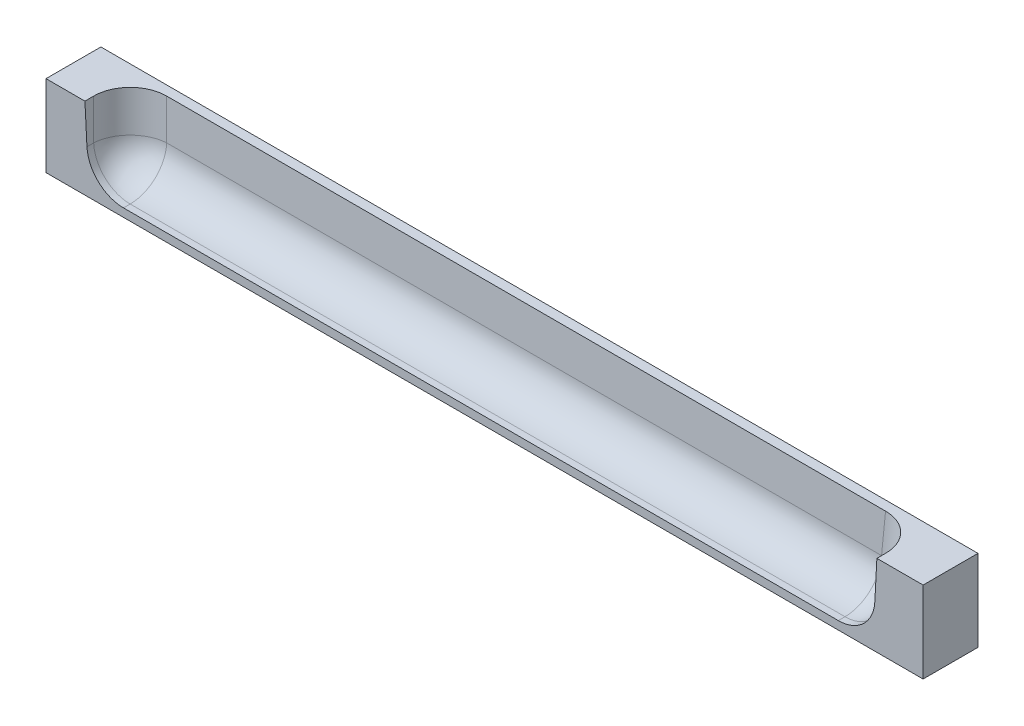
ISO-10303-21;
HEADER;
FILE_DESCRIPTION(('STEP AP214'),'2;1');
FILE_NAME('part.step','',(''),(''),'','','');
FILE_SCHEMA(('AUTOMOTIVE_DESIGN { 1 0 10303 214 1 1 1 1 }'));
ENDSEC;
DATA;
#1=APPLICATION_CONTEXT('core data for automotive mechanical design processes');
#2=APPLICATION_PROTOCOL_DEFINITION('international standard','automotive_design',2000,#1);
#3=PRODUCT_CONTEXT('',#1,'mechanical');
#4=PRODUCT('Part','Part','',(#3));
#5=PRODUCT_RELATED_PRODUCT_CATEGORY('part','',(#4));
#6=PRODUCT_DEFINITION_FORMATION('','',#4);
#7=PRODUCT_DEFINITION_CONTEXT('part definition',#1,'design');
#8=PRODUCT_DEFINITION('design','',#6,#7);
#9=PRODUCT_DEFINITION_SHAPE('','',#8);
#10=(LENGTH_UNIT() NAMED_UNIT(*) SI_UNIT(.MILLI.,.METRE.));
#11=(NAMED_UNIT(*) PLANE_ANGLE_UNIT() SI_UNIT($,.RADIAN.));
#12=(NAMED_UNIT(*) SI_UNIT($,.STERADIAN.) SOLID_ANGLE_UNIT());
#13=UNCERTAINTY_MEASURE_WITH_UNIT(LENGTH_MEASURE(1.E-05),#10,'distance_accuracy_value','');
#14=(GEOMETRIC_REPRESENTATION_CONTEXT(3) GLOBAL_UNCERTAINTY_ASSIGNED_CONTEXT((#13)) GLOBAL_UNIT_ASSIGNED_CONTEXT((#10,
#11,#12)) REPRESENTATION_CONTEXT('',''));
#15=CARTESIAN_POINT('',(0.,0.,0.));
#16=DIRECTION('',(0.,0.,1.));
#17=DIRECTION('',(1.,0.,0.));
#18=AXIS2_PLACEMENT_3D('',#15,#16,#17);
#19=CARTESIAN_POINT('',(-49.2182375036744,20.,-67.8890673333311));
#20=DIRECTION('',(1.,0.,0.));
#21=DIRECTION('',(0.,0.,-1.));
#22=AXIS2_PLACEMENT_3D('',#19,#20,#21);
#23=CYLINDRICAL_SURFACE('',#22,10.);
#24=DIRECTION('',(1.,0.,0.));
#25=VECTOR('',#24,1.);
#26=CARTESIAN_POINT('',(-49.2182375036744,19.4766404375705,-77.8753626808768));
#27=LINE('',#26,#25);
#28=CARTESIAN_POINT('',(42.3499687326921,19.4766404375705,-77.8753626808768));
#29=VERTEX_POINT('',#28);
#30=CARTESIAN_POINT('',(237.697151459334,19.4766404375705,-77.8753626808768));
#31=VERTEX_POINT('',#30);
#32=EDGE_CURVE('E171',#29,#31,#27,.T.);
#33=ORIENTED_EDGE('',*,*,#32,.F.);
#34=CARTESIAN_POINT('',(42.3499687326921,20.,-67.8890673333311));
#35=DIRECTION('',(1.,0.,0.));
#36=DIRECTION('',(0.,0.,-1.));
#37=AXIS2_PLACEMENT_3D('',#34,#35,#36);
#38=CIRCLE('',#37,10.);
#39=CARTESIAN_POINT('',(42.3499687326921,10.,-67.8890673333311));
#40=VERTEX_POINT('',#39);
#41=EDGE_CURVE('E195',#29,#40,#38,.F.);
#42=ORIENTED_EDGE('',*,*,#41,.T.);
#43=DIRECTION('',(1.,0.,0.));
#44=VECTOR('',#43,1.);
#45=CARTESIAN_POINT('',(0.,10.,-67.8890673333311));
#46=LINE('',#45,#44);
#47=CARTESIAN_POINT('',(237.697151459334,10.,-67.8890673333311));
#48=VERTEX_POINT('',#47);
#49=EDGE_CURVE('E162',#48,#40,#46,.F.);
#50=ORIENTED_EDGE('',*,*,#49,.F.);
#51=CARTESIAN_POINT('',(237.697151459334,20.,-67.8890673333311));
#52=DIRECTION('',(1.,0.,0.));
#53=DIRECTION('',(0.,0.,-1.));
#54=AXIS2_PLACEMENT_3D('',#51,#52,#53);
#55=CIRCLE('',#54,10.);
#56=EDGE_CURVE('E193',#48,#31,#55,.T.);
#57=ORIENTED_EDGE('',*,*,#56,.T.);
#58=EDGE_LOOP('',(#33,#42,#50,#57));
#59=FACE_BOUND('',#58,.T.);
#60=ADVANCED_FACE('F43',(#59),#23,.F.);
#61=CARTESIAN_POINT('',(42.3499687326921,20.,-67.8890673333311));
#62=DIRECTION('',(0.,0.,1.));
#63=DIRECTION('',(1.,0.,0.));
#64=AXIS2_PLACEMENT_3D('',#61,#62,#63);
#65=SPHERICAL_SURFACE('',#64,10.);
#66=CARTESIAN_POINT('',(42.3499687326921,20.,-67.8890673333311));
#67=DIRECTION('',(0.,0.,-1.));
#68=DIRECTION('',(-1.,0.,0.));
#69=AXIS2_PLACEMENT_3D('',#66,#67,#68);
#70=CIRCLE('',#69,10.);
#71=CARTESIAN_POINT('',(32.3636733851464,19.4766404375706,-67.8890673333311));
#72=VERTEX_POINT('',#71);
#73=EDGE_CURVE('E197',#40,#72,#70,.T.);
#74=ORIENTED_EDGE('',*,*,#73,.F.);
#75=ORIENTED_EDGE('',*,*,#41,.F.);
#76=CARTESIAN_POINT('',(42.3499687326921,20.,-67.8890673333311));
#77=DIRECTION('',(0.05226442768871,-0.997264688634237,0.0522644276887183));
#78=DIRECTION('',(0.,-0.0523359562429482,-0.998629534754574));
#79=AXIS2_PLACEMENT_3D('',#76,#77,#78);
#80=CIRCLE('',#79,10.);
#81=EDGE_CURVE('E201',#72,#29,#80,.T.);
#82=ORIENTED_EDGE('',*,*,#81,.F.);
#83=EDGE_LOOP('',(#74,#75,#82));
#84=FACE_BOUND('',#83,.T.);
#85=ADVANCED_FACE('F280',(#84),#65,.F.);
#86=CARTESIAN_POINT('',(0.,10.,0.));
#87=DIRECTION('',(0.,-1.,0.));
#88=DIRECTION('',(0.,0.,-1.));
#89=AXIS2_PLACEMENT_3D('',#86,#87,#88);
#90=PLANE('',#89);
#91=DIRECTION('',(0.,0.,-1.));
#92=VECTOR('',#91,1.);
#93=CARTESIAN_POINT('',(42.3499687326921,10.,0.));
#94=LINE('',#93,#92);
#95=CARTESIAN_POINT('',(42.3499687326921,10.,-66.0627350395195));
#96=VERTEX_POINT('',#95);
#97=EDGE_CURVE('E159',#40,#96,#94,.F.);
#98=ORIENTED_EDGE('',*,*,#97,.T.);
#99=DIRECTION('',(1.,0.,0.));
#100=VECTOR('',#99,1.);
#101=CARTESIAN_POINT('',(0.,10.,-66.0627350395195));
#102=LINE('',#101,#100);
#103=CARTESIAN_POINT('',(237.697151459334,10.,-66.0627350395195));
#104=VERTEX_POINT('',#103);
#105=EDGE_CURVE('E11',#96,#104,#102,.T.);
#106=ORIENTED_EDGE('',*,*,#105,.T.);
#107=DIRECTION('',(0.,0.,-1.));
#108=VECTOR('',#107,1.);
#109=CARTESIAN_POINT('',(237.697151459334,10.,-77.3787130004799));
#110=LINE('',#109,#108);
#111=EDGE_CURVE('E165',#104,#48,#110,.T.);
#112=ORIENTED_EDGE('',*,*,#111,.T.);
#113=ORIENTED_EDGE('',*,*,#49,.T.);
#114=EDGE_LOOP('',(#98,#106,#112,#113));
#115=FACE_BOUND('',#114,.T.);
#116=ADVANCED_FACE('F286',(#115),#90,.F.);
#117=CARTESIAN_POINT('',(237.697151459334,20.,-67.8890673333311));
#118=DIRECTION('',(0.,0.,1.));
#119=DIRECTION('',(1.,0.,0.));
#120=AXIS2_PLACEMENT_3D('',#117,#118,#119);
#121=SPHERICAL_SURFACE('',#120,10.);
#122=ORIENTED_EDGE('',*,*,#56,.F.);
#123=CARTESIAN_POINT('',(237.697151459334,20.,-67.8890673333311));
#124=DIRECTION('',(0.,0.,1.));
#125=DIRECTION('',(1.,0.,0.));
#126=AXIS2_PLACEMENT_3D('',#123,#124,#125);
#127=CIRCLE('',#126,10.);
#128=CARTESIAN_POINT('',(247.68344680688,19.4766404375706,-67.8890673333311));
#129=VERTEX_POINT('',#128);
#130=EDGE_CURVE('E199',#129,#48,#127,.F.);
#131=ORIENTED_EDGE('',*,*,#130,.F.);
#132=CARTESIAN_POINT('',(237.697151459334,20.,-67.8890673333311));
#133=DIRECTION('',(-0.0522644276887111,-0.997264688634237,0.0522644276887187));
#134=DIRECTION('',(0.,-0.0523359562429486,-0.998629534754574));
#135=AXIS2_PLACEMENT_3D('',#132,#133,#134);
#136=CIRCLE('',#135,10.);
#137=EDGE_CURVE('E205',#31,#129,#136,.T.);
#138=ORIENTED_EDGE('',*,*,#137,.F.);
#139=EDGE_LOOP('',(#122,#131,#138));
#140=FACE_BOUND('',#139,.T.);
#141=ADVANCED_FACE('F45',(#140),#121,.F.);
#142=CARTESIAN_POINT('',(245.987097241025,-12.8916374986828,-66.0627350395195));
#143=DIRECTION('',(0.998629534754574,-0.0523359562429405,0.));
#144=DIRECTION('',(0.0523359562429405,0.998629534754574,0.));
#145=AXIS2_PLACEMENT_3D('',#142,#143,#144);
#146=PLANE('',#145);
#147=DIRECTION('',(-0.0523359562429405,-0.998629534754574,0.));
#148=VECTOR('',#147,1.);
#149=CARTESIAN_POINT('',(245.987097241025,-12.8916374986828,-66.0627350395195));
#150=LINE('',#149,#148);
#151=CARTESIAN_POINT('',(248.234952712144,30.,-66.0627350395195));
#152=VERTEX_POINT('',#151);
#153=CARTESIAN_POINT('',(247.68344680688,19.4766404375706,-66.0627350395195));
#154=VERTEX_POINT('',#153);
#155=EDGE_CURVE('E153',#152,#154,#150,.T.);
#156=ORIENTED_EDGE('',*,*,#155,.F.);
#157=DIRECTION('',(0.,0.,-1.));
#158=VECTOR('',#157,1.);
#159=CARTESIAN_POINT('',(248.234952712144,30.,-66.0627350395195));
#160=LINE('',#159,#158);
#161=CARTESIAN_POINT('',(248.234952712144,30.,-68.440573238595));
#162=VERTEX_POINT('',#161);
#163=EDGE_CURVE('E232',#152,#162,#160,.T.);
#164=ORIENTED_EDGE('',*,*,#163,.T.);
#165=DIRECTION('',(-0.0522644276887106,-0.997264688634237,0.0522644276887177));
#166=VECTOR('',#165,1.);
#167=CARTESIAN_POINT('',(245.986742184053,-12.8984123893053,-66.1923627105033));
#168=LINE('',#167,#166);
#169=EDGE_CURVE('E191',#162,#129,#168,.T.);
#170=ORIENTED_EDGE('',*,*,#169,.T.);
#171=DIRECTION('',(0.,0.,-1.));
#172=VECTOR('',#171,1.);
#173=CARTESIAN_POINT('',(247.68344680688,19.4766404375706,-66.0627350395195));
#174=LINE('',#173,#172);
#175=EDGE_CURVE('E168',#129,#154,#174,.F.);
#176=ORIENTED_EDGE('',*,*,#175,.T.);
#177=EDGE_LOOP('',(#156,#164,#170,#176));
#178=FACE_BOUND('',#177,.T.);
#179=ADVANCED_FACE('F231',(#178),#146,.F.);
#180=CARTESIAN_POINT('',(236.000446836507,-12.3750528268758,-66.1923627105033));
#181=DIRECTION('',(-0.0522644276887106,-0.997264688634237,0.0522644276887177));
#182=DIRECTION('',(0.,-0.0523359562429476,-0.998629534754574));
#183=AXIS2_PLACEMENT_3D('',#180,#181,#182);
#184=CYLINDRICAL_SURFACE('',#183,10.);
#185=ORIENTED_EDGE('',*,*,#169,.F.);
#186=CARTESIAN_POINT('',(238.221229252165,30.,-68.4131451261616));
#187=DIRECTION('',(0.,-1.,0.));
#188=DIRECTION('',(-0.7071067811865,0.,0.707106781186595));
#189=AXIS2_PLACEMENT_3D('',#186,#187,#188);
#190=ELLIPSE('',#189,10.0274281381557,10.);
#191=CARTESIAN_POINT('',(238.248657364598,30.,-78.4268685861408));
#192=VERTEX_POINT('',#191);
#193=EDGE_CURVE('E51',#162,#192,#190,.F.);
#194=ORIENTED_EDGE('',*,*,#193,.T.);
#195=DIRECTION('',(-0.0522644276887106,-0.997264688634237,0.0522644276887177));
#196=VECTOR('',#195,1.);
#197=CARTESIAN_POINT('',(240.09208770172,65.1747462369226,-80.2702989232625));
#198=LINE('',#197,#196);
#199=EDGE_CURVE('E183',#31,#192,#198,.F.);
#200=ORIENTED_EDGE('',*,*,#199,.F.);
#201=ORIENTED_EDGE('',*,*,#137,.T.);
#202=EDGE_LOOP('',(#185,#194,#200,#201));
#203=FACE_BOUND('',#202,.T.);
#204=ADVANCED_FACE('F211',(#203),#184,.F.);
#205=CARTESIAN_POINT('',(-49.2182375036744,80.2953280875141,-81.0627350395195));
#206=DIRECTION('',(0.,0.0523359562429476,0.998629534754574));
#207=DIRECTION('',(0.,-0.998629534754574,0.0523359562429476));
#208=AXIS2_PLACEMENT_3D('',#205,#206,#207);
#209=PLANE('',#208);
#210=DIRECTION('',(1.,0.,0.));
#211=VECTOR('',#210,1.);
#212=CARTESIAN_POINT('',(-49.2182375036744,30.,-78.4268685861408));
#213=LINE('',#212,#211);
#214=CARTESIAN_POINT('',(41.7984628274282,30.,-78.4268685861408));
#215=VERTEX_POINT('',#214);
#216=EDGE_CURVE('E66',#215,#192,#213,.T.);
#217=ORIENTED_EDGE('',*,*,#216,.F.);
#218=DIRECTION('',(0.0522644276887101,-0.997264688634237,0.0522644276887177));
#219=VECTOR('',#218,1.);
#220=CARTESIAN_POINT('',(42.3226904638988,19.9971408130197,-77.9026409496701));
#221=LINE('',#220,#219);
#222=EDGE_CURVE('E186',#215,#29,#221,.T.);
#223=ORIENTED_EDGE('',*,*,#222,.T.);
#224=ORIENTED_EDGE('',*,*,#32,.T.);
#225=ORIENTED_EDGE('',*,*,#199,.T.);
#226=EDGE_LOOP('',(#217,#223,#224,#225));
#227=FACE_BOUND('',#226,.T.);
#228=ADVANCED_FACE('F215',(#227),#209,.T.);
#229=CARTESIAN_POINT('',(38.9211779041582,85.4252264728883,-71.3178581618655));
#230=DIRECTION('',(-0.0522644276887101,0.997264688634237,-0.0522644276887177));
#231=DIRECTION('',(0.,0.0523359562429476,0.998629534754574));
#232=AXIS2_PLACEMENT_3D('',#229,#230,#231);
#233=CYLINDRICAL_SURFACE('',#232,10.);
#234=ORIENTED_EDGE('',*,*,#222,.F.);
#235=CARTESIAN_POINT('',(41.8258909398617,30.,-68.4131451261616));
#236=DIRECTION('',(0.,-1.,0.));
#237=DIRECTION('',(-0.707106781186496,0.,-0.707106781186599));
#238=AXIS2_PLACEMENT_3D('',#235,#236,#237);
#239=ELLIPSE('',#238,10.0274281381557,10.);
#240=CARTESIAN_POINT('',(31.8121674798825,30.,-68.440573238595));
#241=VERTEX_POINT('',#240);
#242=EDGE_CURVE('E234',#215,#241,#239,.F.);
#243=ORIENTED_EDGE('',*,*,#242,.T.);
#244=DIRECTION('',(0.0522644276887101,-0.997264688634237,0.0522644276887177));
#245=VECTOR('',#244,1.);
#246=CARTESIAN_POINT('',(29.1490227577108,80.8158284629633,-71.1037179607671));
#247=LINE('',#246,#245);
#248=EDGE_CURVE('E188',#72,#241,#247,.F.);
#249=ORIENTED_EDGE('',*,*,#248,.F.);
#250=ORIENTED_EDGE('',*,*,#81,.T.);
#251=EDGE_LOOP('',(#234,#243,#249,#250));
#252=FACE_BOUND('',#251,.T.);
#253=ADVANCED_FACE('F277',(#252),#233,.F.);
#254=CARTESIAN_POINT('',(33.2929592378888,1.74481005941844,-66.0627350395195));
#255=DIRECTION('',(0.998629534754574,0.05233595624294,0.));
#256=DIRECTION('',(-0.05233595624294,0.998629534754574,0.));
#257=AXIS2_PLACEMENT_3D('',#254,#255,#256);
#258=PLANE('',#257);
#259=DIRECTION('',(0.,0.,-1.));
#260=VECTOR('',#259,1.);
#261=CARTESIAN_POINT('',(31.8121674798825,30.,-66.0627350395195));
#262=LINE('',#261,#260);
#263=CARTESIAN_POINT('',(31.8121674798825,30.,-66.0627350395195));
#264=VERTEX_POINT('',#263);
#265=EDGE_CURVE('E237',#264,#241,#262,.T.);
#266=ORIENTED_EDGE('',*,*,#265,.F.);
#267=DIRECTION('',(0.05233595624294,-0.998629534754574,0.));
#268=VECTOR('',#267,1.);
#269=CARTESIAN_POINT('',(33.2929592378888,1.74481005941844,-66.0627350395195));
#270=LINE('',#269,#268);
#271=CARTESIAN_POINT('',(32.3636733851464,19.4766404375706,-66.0627350395195));
#272=VERTEX_POINT('',#271);
#273=EDGE_CURVE('E151',#264,#272,#270,.T.);
#274=ORIENTED_EDGE('',*,*,#273,.T.);
#275=DIRECTION('',(0.,0.,-1.));
#276=VECTOR('',#275,1.);
#277=CARTESIAN_POINT('',(32.3636733851464,19.4766404375706,-66.0627350395195));
#278=LINE('',#277,#276);
#279=EDGE_CURVE('E174',#272,#72,#278,.T.);
#280=ORIENTED_EDGE('',*,*,#279,.T.);
#281=ORIENTED_EDGE('',*,*,#248,.T.);
#282=EDGE_LOOP('',(#266,#274,#280,#281));
#283=FACE_BOUND('',#282,.T.);
#284=ADVANCED_FACE('F272',(#283),#258,.T.);
#285=CARTESIAN_POINT('',(21.1735600960133,30.,-81.0627350395195));
#286=DIRECTION('',(0.,-1.,0.));
#287=DIRECTION('',(1.,0.,0.));
#288=AXIS2_PLACEMENT_3D('',#285,#286,#287);
#289=PLANE('',#288);
#290=ORIENTED_EDGE('',*,*,#265,.T.);
#291=ORIENTED_EDGE('',*,*,#242,.F.);
#292=ORIENTED_EDGE('',*,*,#216,.T.);
#293=ORIENTED_EDGE('',*,*,#193,.F.);
#294=ORIENTED_EDGE('',*,*,#163,.F.);
#295=DIRECTION('',(-1.,0.,0.));
#296=VECTOR('',#295,1.);
#297=CARTESIAN_POINT('',(0.,30.,-66.0627350395195));
#298=LINE('',#297,#296);
#299=CARTESIAN_POINT('',(260.870819165522,30.,-66.0627350395195));
#300=VERTEX_POINT('',#299);
#301=EDGE_CURVE('E244',#300,#152,#298,.T.);
#302=ORIENTED_EDGE('',*,*,#301,.F.);
#303=DIRECTION('',(0.,0.,1.));
#304=VECTOR('',#303,1.);
#305=CARTESIAN_POINT('',(260.870819165522,30.,-81.0627350395195));
#306=LINE('',#305,#304);
#307=CARTESIAN_POINT('',(260.870819165522,30.,-81.0627350395195));
#308=VERTEX_POINT('',#307);
#309=EDGE_CURVE('E239',#308,#300,#306,.T.);
#310=ORIENTED_EDGE('',*,*,#309,.F.);
#311=DIRECTION('',(1.,0.,0.));
#312=VECTOR('',#311,1.);
#313=CARTESIAN_POINT('',(21.1735600960133,30.,-81.0627350395195));
#314=LINE('',#313,#312);
#315=CARTESIAN_POINT('',(21.1735600960133,30.,-81.0627350395195));
#316=VERTEX_POINT('',#315);
#317=EDGE_CURVE('E150',#316,#308,#314,.T.);
#318=ORIENTED_EDGE('',*,*,#317,.F.);
#319=DIRECTION('',(0.,0.,1.));
#320=VECTOR('',#319,1.);
#321=CARTESIAN_POINT('',(21.1735600960133,30.,-81.0627350395195));
#322=LINE('',#321,#320);
#323=CARTESIAN_POINT('',(21.1735600960133,30.,-66.0627350395195));
#324=VERTEX_POINT('',#323);
#325=EDGE_CURVE('E255',#316,#324,#322,.T.);
#326=ORIENTED_EDGE('',*,*,#325,.T.);
#327=DIRECTION('',(-1.,0.,0.));
#328=VECTOR('',#327,1.);
#329=CARTESIAN_POINT('',(0.,30.,-66.0627350395195));
#330=LINE('',#329,#328);
#331=EDGE_CURVE('E207',#264,#324,#330,.T.);
#332=ORIENTED_EDGE('',*,*,#331,.F.);
#333=EDGE_LOOP('',(#290,#291,#292,#293,#294,#302,#310,#318,#326,#332));
#334=FACE_BOUND('',#333,.T.);
#335=ADVANCED_FACE('F254',(#334),#289,.F.);
#336=CARTESIAN_POINT('',(237.697151459334,20.,0.));
#337=DIRECTION('',(0.,0.,1.));
#338=DIRECTION('',(1.,0.,0.));
#339=AXIS2_PLACEMENT_3D('',#336,#337,#338);
#340=CYLINDRICAL_SURFACE('',#339,10.);
#341=ORIENTED_EDGE('',*,*,#175,.F.);
#342=ORIENTED_EDGE('',*,*,#130,.T.);
#343=ORIENTED_EDGE('',*,*,#111,.F.);
#344=CARTESIAN_POINT('',(237.697151459334,20.,-66.0627350395195));
#345=DIRECTION('',(0.,0.,-1.));
#346=DIRECTION('',(-1.,0.,0.));
#347=AXIS2_PLACEMENT_3D('',#344,#345,#346);
#348=CIRCLE('',#347,10.);
#349=EDGE_CURVE('E177',#154,#104,#348,.T.);
#350=ORIENTED_EDGE('',*,*,#349,.F.);
#351=EDGE_LOOP('',(#341,#342,#343,#350));
#352=FACE_BOUND('',#351,.T.);
#353=ADVANCED_FACE('F228',(#352),#340,.F.);
#354=CARTESIAN_POINT('',(42.3499687326921,20.,-66.0627350395195));
#355=DIRECTION('',(0.,0.,-1.));
#356=DIRECTION('',(-1.,0.,0.));
#357=AXIS2_PLACEMENT_3D('',#354,#355,#356);
#358=CYLINDRICAL_SURFACE('',#357,10.);
#359=ORIENTED_EDGE('',*,*,#97,.F.);
#360=ORIENTED_EDGE('',*,*,#73,.T.);
#361=ORIENTED_EDGE('',*,*,#279,.F.);
#362=CARTESIAN_POINT('',(42.3499687326921,20.,-66.0627350395195));
#363=DIRECTION('',(0.,0.,-1.));
#364=DIRECTION('',(-1.,0.,0.));
#365=AXIS2_PLACEMENT_3D('',#362,#363,#364);
#366=CIRCLE('',#365,10.);
#367=EDGE_CURVE('E180',#96,#272,#366,.T.);
#368=ORIENTED_EDGE('',*,*,#367,.F.);
#369=EDGE_LOOP('',(#359,#360,#361,#368));
#370=FACE_BOUND('',#369,.T.);
#371=ADVANCED_FACE('F283',(#370),#358,.F.);
#372=CARTESIAN_POINT('',(0.,10.,-81.0627350395195));
#373=DIRECTION('',(0.,0.,1.));
#374=DIRECTION('',(1.,0.,0.));
#375=AXIS2_PLACEMENT_3D('',#372,#373,#374);
#376=PLANE('',#375);
#377=DIRECTION('',(0.,-1.,0.));
#378=VECTOR('',#377,1.);
#379=CARTESIAN_POINT('',(260.870819165522,0.,-81.0627350395195));
#380=LINE('',#379,#378);
#381=CARTESIAN_POINT('',(260.870819165522,7.74652097129216,-81.0627350395195));
#382=VERTEX_POINT('',#381);
#383=EDGE_CURVE('E143',#308,#382,#380,.T.);
#384=ORIENTED_EDGE('',*,*,#383,.T.);
#385=DIRECTION('',(-1.,0.,0.));
#386=VECTOR('',#385,1.);
#387=CARTESIAN_POINT('',(21.173560096013,7.74652097129216,-81.0627350395195));
#388=LINE('',#387,#386);
#389=CARTESIAN_POINT('',(21.173560096013,7.74652097129216,-81.0627350395195));
#390=VERTEX_POINT('',#389);
#391=EDGE_CURVE('E129',#382,#390,#388,.T.);
#392=ORIENTED_EDGE('',*,*,#391,.T.);
#393=DIRECTION('',(0.,1.,0.));
#394=VECTOR('',#393,1.);
#395=CARTESIAN_POINT('',(21.173560096013,0.,-81.0627350395195));
#396=LINE('',#395,#394);
#397=EDGE_CURVE('E204',#390,#316,#396,.T.);
#398=ORIENTED_EDGE('',*,*,#397,.T.);
#399=ORIENTED_EDGE('',*,*,#317,.T.);
#400=EDGE_LOOP('',(#384,#392,#398,#399));
#401=FACE_BOUND('',#400,.T.);
#402=ADVANCED_FACE('F148',(#401),#376,.F.);
#403=CARTESIAN_POINT('',(260.870819165522,0.,-66.0627350395195));
#404=DIRECTION('',(1.,0.,0.));
#405=DIRECTION('',(0.,0.,-1.));
#406=AXIS2_PLACEMENT_3D('',#403,#404,#405);
#407=PLANE('',#406);
#408=DIRECTION('',(0.,0.,1.));
#409=VECTOR('',#408,1.);
#410=CARTESIAN_POINT('',(260.870819165522,7.74652097129216,-81.0627350395195));
#411=LINE('',#410,#409);
#412=CARTESIAN_POINT('',(260.870819165522,7.74652097129216,-66.0627350395195));
#413=VERTEX_POINT('',#412);
#414=EDGE_CURVE('E132',#382,#413,#411,.T.);
#415=ORIENTED_EDGE('',*,*,#414,.F.);
#416=ORIENTED_EDGE('',*,*,#383,.F.);
#417=ORIENTED_EDGE('',*,*,#309,.T.);
#418=DIRECTION('',(0.,-1.,0.));
#419=VECTOR('',#418,1.);
#420=CARTESIAN_POINT('',(260.870819165522,0.,-66.0627350395195));
#421=LINE('',#420,#419);
#422=EDGE_CURVE('E145',#300,#413,#421,.T.);
#423=ORIENTED_EDGE('',*,*,#422,.T.);
#424=EDGE_LOOP('',(#415,#416,#417,#423));
#425=FACE_BOUND('',#424,.T.);
#426=ADVANCED_FACE('F141',(#425),#407,.T.);
#427=CARTESIAN_POINT('',(0.,0.,-66.0627350395195));
#428=DIRECTION('',(0.,0.,-1.));
#429=DIRECTION('',(-1.,0.,0.));
#430=AXIS2_PLACEMENT_3D('',#427,#428,#429);
#431=PLANE('',#430);
#432=DIRECTION('',(0.,1.,0.));
#433=VECTOR('',#432,1.);
#434=CARTESIAN_POINT('',(21.173560096013,0.,-66.0627350395195));
#435=LINE('',#434,#433);
#436=CARTESIAN_POINT('',(21.173560096013,7.74652097129216,-66.0627350395195));
#437=VERTEX_POINT('',#436);
#438=EDGE_CURVE('E155',#437,#324,#435,.T.);
#439=ORIENTED_EDGE('',*,*,#438,.F.);
#440=DIRECTION('',(1.,0.,0.));
#441=VECTOR('',#440,1.);
#442=CARTESIAN_POINT('',(0.,7.74652097129216,-66.0627350395195));
#443=LINE('',#442,#441);
#444=EDGE_CURVE('E58',#437,#413,#443,.T.);
#445=ORIENTED_EDGE('',*,*,#444,.T.);
#446=ORIENTED_EDGE('',*,*,#422,.F.);
#447=ORIENTED_EDGE('',*,*,#301,.T.);
#448=ORIENTED_EDGE('',*,*,#155,.T.);
#449=ORIENTED_EDGE('',*,*,#349,.T.);
#450=ORIENTED_EDGE('',*,*,#105,.F.);
#451=ORIENTED_EDGE('',*,*,#367,.T.);
#452=ORIENTED_EDGE('',*,*,#273,.F.);
#453=ORIENTED_EDGE('',*,*,#331,.T.);
#454=EDGE_LOOP('',(#439,#445,#446,#447,#448,#449,#450,#451,#452,#453));
#455=FACE_BOUND('',#454,.T.);
#456=ADVANCED_FACE('F268',(#455),#431,.F.);
#457=CARTESIAN_POINT('',(21.173560096013,0.,-66.0627350395195));
#458=DIRECTION('',(-1.,0.,0.));
#459=DIRECTION('',(0.,-1.,0.));
#460=AXIS2_PLACEMENT_3D('',#457,#458,#459);
#461=PLANE('',#460);
#462=DIRECTION('',(0.,0.,1.));
#463=VECTOR('',#462,1.);
#464=CARTESIAN_POINT('',(21.173560096013,7.74652097129216,-81.0627350395195));
#465=LINE('',#464,#463);
#466=EDGE_CURVE('E133',#390,#437,#465,.T.);
#467=ORIENTED_EDGE('',*,*,#466,.T.);
#468=ORIENTED_EDGE('',*,*,#438,.T.);
#469=ORIENTED_EDGE('',*,*,#325,.F.);
#470=ORIENTED_EDGE('',*,*,#397,.F.);
#471=EDGE_LOOP('',(#467,#468,#469,#470));
#472=FACE_BOUND('',#471,.T.);
#473=ADVANCED_FACE('F258',(#472),#461,.T.);
#474=CARTESIAN_POINT('',(21.173560096013,7.74652097129216,-81.0627350395195));
#475=DIRECTION('',(0.,1.,0.));
#476=DIRECTION('',(0.,0.,1.));
#477=AXIS2_PLACEMENT_3D('',#474,#475,#476);
#478=PLANE('',#477);
#479=ORIENTED_EDGE('',*,*,#466,.F.);
#480=ORIENTED_EDGE('',*,*,#391,.F.);
#481=ORIENTED_EDGE('',*,*,#414,.T.);
#482=ORIENTED_EDGE('',*,*,#444,.F.);
#483=EDGE_LOOP('',(#479,#480,#481,#482));
#484=FACE_BOUND('',#483,.T.);
#485=ADVANCED_FACE('F131',(#484),#478,.F.);
#486=CLOSED_SHELL('',(#60,#85,#116,#141,#179,#204,#228,#253,#284,#335,#353,#371,#402,#426,#456,
#473,#485));
#487=MANIFOLD_SOLID_BREP('B2',#486);
#488=ADVANCED_BREP_SHAPE_REPRESENTATION('',(#18,#487),#14);
#489=SHAPE_DEFINITION_REPRESENTATION(#9,#488);
ENDSEC;
END-ISO-10303-21;
